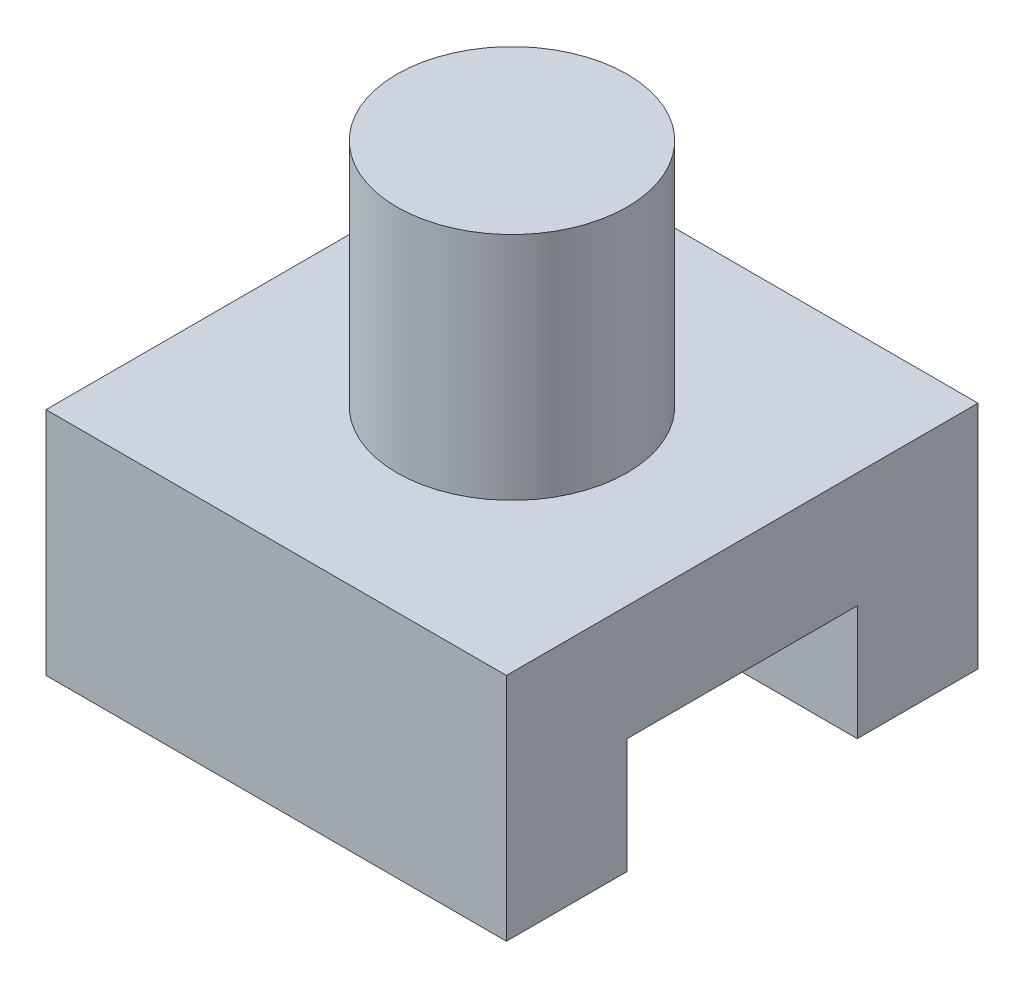
ISO-10303-21;
HEADER;
FILE_DESCRIPTION(('STEP AP214'),'2;1');
FILE_NAME('part.step','',(''),(''),'','','');
FILE_SCHEMA(('AUTOMOTIVE_DESIGN { 1 0 10303 214 1 1 1 1 }'));
ENDSEC;
DATA;
#1=APPLICATION_CONTEXT('core data for automotive mechanical design processes');
#2=APPLICATION_PROTOCOL_DEFINITION('international standard','automotive_design',2000,#1);
#3=PRODUCT_CONTEXT('',#1,'mechanical');
#4=PRODUCT('Part','Part','',(#3));
#5=PRODUCT_RELATED_PRODUCT_CATEGORY('part','',(#4));
#6=PRODUCT_DEFINITION_FORMATION('','',#4);
#7=PRODUCT_DEFINITION_CONTEXT('part definition',#1,'design');
#8=PRODUCT_DEFINITION('design','',#6,#7);
#9=PRODUCT_DEFINITION_SHAPE('','',#8);
#10=(LENGTH_UNIT() NAMED_UNIT(*) SI_UNIT(.MILLI.,.METRE.));
#11=(NAMED_UNIT(*) PLANE_ANGLE_UNIT() SI_UNIT($,.RADIAN.));
#12=(NAMED_UNIT(*) SI_UNIT($,.STERADIAN.) SOLID_ANGLE_UNIT());
#13=UNCERTAINTY_MEASURE_WITH_UNIT(LENGTH_MEASURE(1.E-05),#10,'distance_accuracy_value','');
#14=(GEOMETRIC_REPRESENTATION_CONTEXT(3) GLOBAL_UNCERTAINTY_ASSIGNED_CONTEXT((#13)) GLOBAL_UNIT_ASSIGNED_CONTEXT((#10,
#11,#12)) REPRESENTATION_CONTEXT('',''));
#15=CARTESIAN_POINT('',(0.,0.,0.));
#16=DIRECTION('',(0.,0.,1.));
#17=DIRECTION('',(1.,0.,0.));
#18=AXIS2_PLACEMENT_3D('',#15,#16,#17);
#19=CARTESIAN_POINT('',(101.6,-25.4,-52.0390243902439));
#20=DIRECTION('',(0.,0.,1.));
#21=DIRECTION('',(1.,0.,0.));
#22=AXIS2_PLACEMENT_3D('',#19,#20,#21);
#23=PLANE('',#22);
#24=DIRECTION('',(0.,1.,0.));
#25=VECTOR('',#24,1.);
#26=CARTESIAN_POINT('',(0.,-25.4,-52.0390243902439));
#27=LINE('',#26,#25);
#28=CARTESIAN_POINT('',(0.,-25.4,-52.0390243902439));
#29=VERTEX_POINT('',#28);
#30=CARTESIAN_POINT('',(0.,25.4,-52.0390243902439));
#31=VERTEX_POINT('',#30);
#32=EDGE_CURVE('E137',#29,#31,#27,.T.);
#33=ORIENTED_EDGE('',*,*,#32,.T.);
#34=DIRECTION('',(-1.,0.,0.));
#35=VECTOR('',#34,1.);
#36=CARTESIAN_POINT('',(101.6,25.4,-52.0390243902439));
#37=LINE('',#36,#35);
#38=CARTESIAN_POINT('',(101.6,25.4,-52.0390243902439));
#39=VERTEX_POINT('',#38);
#40=EDGE_CURVE('E42',#39,#31,#37,.T.);
#41=ORIENTED_EDGE('',*,*,#40,.F.);
#42=DIRECTION('',(0.,1.,0.));
#43=VECTOR('',#42,1.);
#44=CARTESIAN_POINT('',(101.6,-25.4,-52.0390243902439));
#45=LINE('',#44,#43);
#46=CARTESIAN_POINT('',(101.6,-25.4,-52.0390243902439));
#47=VERTEX_POINT('',#46);
#48=EDGE_CURVE('E152',#47,#39,#45,.T.);
#49=ORIENTED_EDGE('',*,*,#48,.F.);
#50=DIRECTION('',(-1.,0.,0.));
#51=VECTOR('',#50,1.);
#52=CARTESIAN_POINT('',(101.6,-25.4,-52.0390243902439));
#53=LINE('',#52,#51);
#54=EDGE_CURVE('E133',#47,#29,#53,.T.);
#55=ORIENTED_EDGE('',*,*,#54,.T.);
#56=EDGE_LOOP('',(#33,#41,#49,#55));
#57=FACE_BOUND('',#56,.T.);
#58=ADVANCED_FACE('F39',(#57),#23,.F.);
#59=CARTESIAN_POINT('',(101.6,25.4,52.0390243902439));
#60=DIRECTION('',(0.,-1.,0.));
#61=DIRECTION('',(0.,0.,-1.));
#62=AXIS2_PLACEMENT_3D('',#59,#60,#61);
#63=PLANE('',#62);
#64=CARTESIAN_POINT('',(50.8,25.4,0.));
#65=DIRECTION('',(0.,1.,0.));
#66=DIRECTION('',(0.,0.,1.));
#67=AXIS2_PLACEMENT_3D('',#64,#65,#66);
#68=CIRCLE('',#67,25.4);
#69=CARTESIAN_POINT('',(50.8,25.4,25.4));
#70=VERTEX_POINT('',#69);
#71=EDGE_CURVE('E11',#70,#70,#68,.T.);
#72=ORIENTED_EDGE('',*,*,#71,.F.);
#73=EDGE_LOOP('',(#72));
#74=FACE_BOUND('',#73,.T.);
#75=DIRECTION('',(0.,0.,1.));
#76=VECTOR('',#75,1.);
#77=CARTESIAN_POINT('',(0.,25.4,52.0390243902439));
#78=LINE('',#77,#76);
#79=CARTESIAN_POINT('',(0.,25.4,52.0390243902439));
#80=VERTEX_POINT('',#79);
#81=EDGE_CURVE('E140',#31,#80,#78,.T.);
#82=ORIENTED_EDGE('',*,*,#81,.T.);
#83=DIRECTION('',(-1.,0.,0.));
#84=VECTOR('',#83,1.);
#85=CARTESIAN_POINT('',(101.6,25.4,52.0390243902439));
#86=LINE('',#85,#84);
#87=CARTESIAN_POINT('',(101.6,25.4,52.0390243902439));
#88=VERTEX_POINT('',#87);
#89=EDGE_CURVE('E161',#88,#80,#86,.T.);
#90=ORIENTED_EDGE('',*,*,#89,.F.);
#91=DIRECTION('',(0.,0.,1.));
#92=VECTOR('',#91,1.);
#93=CARTESIAN_POINT('',(101.6,25.4,52.0390243902439));
#94=LINE('',#93,#92);
#95=EDGE_CURVE('E100',#39,#88,#94,.T.);
#96=ORIENTED_EDGE('',*,*,#95,.F.);
#97=ORIENTED_EDGE('',*,*,#40,.T.);
#98=EDGE_LOOP('',(#82,#90,#96,#97));
#99=FACE_BOUND('',#98,.T.);
#100=ADVANCED_FACE('F167',(#74,#99),#63,.F.);
#101=CARTESIAN_POINT('',(101.6,-25.4,52.0390243902439));
#102=DIRECTION('',(0.,0.,-1.));
#103=DIRECTION('',(-1.,0.,0.));
#104=AXIS2_PLACEMENT_3D('',#101,#102,#103);
#105=PLANE('',#104);
#106=DIRECTION('',(0.,-1.,0.));
#107=VECTOR('',#106,1.);
#108=CARTESIAN_POINT('',(0.,-25.4,52.0390243902439));
#109=LINE('',#108,#107);
#110=CARTESIAN_POINT('',(0.,-25.4,52.0390243902439));
#111=VERTEX_POINT('',#110);
#112=EDGE_CURVE('E143',#80,#111,#109,.T.);
#113=ORIENTED_EDGE('',*,*,#112,.T.);
#114=DIRECTION('',(-1.,0.,0.));
#115=VECTOR('',#114,1.);
#116=CARTESIAN_POINT('',(101.6,-25.4,52.0390243902439));
#117=LINE('',#116,#115);
#118=CARTESIAN_POINT('',(101.6,-25.4,52.0390243902439));
#119=VERTEX_POINT('',#118);
#120=EDGE_CURVE('E159',#119,#111,#117,.T.);
#121=ORIENTED_EDGE('',*,*,#120,.F.);
#122=DIRECTION('',(0.,-1.,0.));
#123=VECTOR('',#122,1.);
#124=CARTESIAN_POINT('',(101.6,-25.4,52.0390243902439));
#125=LINE('',#124,#123);
#126=EDGE_CURVE('E182',#88,#119,#125,.T.);
#127=ORIENTED_EDGE('',*,*,#126,.F.);
#128=ORIENTED_EDGE('',*,*,#89,.T.);
#129=EDGE_LOOP('',(#113,#121,#127,#128));
#130=FACE_BOUND('',#129,.T.);
#131=ADVANCED_FACE('F176',(#130),#105,.F.);
#132=CARTESIAN_POINT('',(101.6,-25.4,52.0390243902439));
#133=DIRECTION('',(0.,1.,0.));
#134=DIRECTION('',(0.,0.,1.));
#135=AXIS2_PLACEMENT_3D('',#132,#133,#134);
#136=PLANE('',#135);
#137=DIRECTION('',(0.,0.,-1.));
#138=VECTOR('',#137,1.);
#139=CARTESIAN_POINT('',(0.,-25.4,52.0390243902439));
#140=LINE('',#139,#138);
#141=CARTESIAN_POINT('',(0.,-25.4,25.4));
#142=VERTEX_POINT('',#141);
#143=EDGE_CURVE('E145',#111,#142,#140,.T.);
#144=ORIENTED_EDGE('',*,*,#143,.T.);
#145=DIRECTION('',(-1.,0.,0.));
#146=VECTOR('',#145,1.);
#147=CARTESIAN_POINT('',(101.6,-25.4,25.4));
#148=LINE('',#147,#146);
#149=CARTESIAN_POINT('',(101.6,-25.4,25.4));
#150=VERTEX_POINT('',#149);
#151=EDGE_CURVE('E156',#150,#142,#148,.T.);
#152=ORIENTED_EDGE('',*,*,#151,.F.);
#153=DIRECTION('',(0.,0.,-1.));
#154=VECTOR('',#153,1.);
#155=CARTESIAN_POINT('',(101.6,-25.4,52.0390243902439));
#156=LINE('',#155,#154);
#157=EDGE_CURVE('E181',#119,#150,#156,.T.);
#158=ORIENTED_EDGE('',*,*,#157,.F.);
#159=ORIENTED_EDGE('',*,*,#120,.T.);
#160=EDGE_LOOP('',(#144,#152,#158,#159));
#161=FACE_BOUND('',#160,.T.);
#162=ADVANCED_FACE('F179',(#161),#136,.F.);
#163=CARTESIAN_POINT('',(101.6,0.,25.4));
#164=DIRECTION('',(0.,0.,1.));
#165=DIRECTION('',(0.,-1.,0.));
#166=AXIS2_PLACEMENT_3D('',#163,#164,#165);
#167=PLANE('',#166);
#168=DIRECTION('',(0.,1.,0.));
#169=VECTOR('',#168,1.);
#170=CARTESIAN_POINT('',(0.,0.,25.4));
#171=LINE('',#170,#169);
#172=CARTESIAN_POINT('',(0.,0.,25.4));
#173=VERTEX_POINT('',#172);
#174=EDGE_CURVE('E147',#142,#173,#171,.T.);
#175=ORIENTED_EDGE('',*,*,#174,.T.);
#176=DIRECTION('',(-1.,0.,0.));
#177=VECTOR('',#176,1.);
#178=CARTESIAN_POINT('',(101.6,0.,25.4));
#179=LINE('',#178,#177);
#180=CARTESIAN_POINT('',(101.6,0.,25.4));
#181=VERTEX_POINT('',#180);
#182=EDGE_CURVE('E128',#181,#173,#179,.T.);
#183=ORIENTED_EDGE('',*,*,#182,.F.);
#184=DIRECTION('',(0.,1.,0.));
#185=VECTOR('',#184,1.);
#186=CARTESIAN_POINT('',(101.6,0.,25.4));
#187=LINE('',#186,#185);
#188=EDGE_CURVE('E119',#150,#181,#187,.T.);
#189=ORIENTED_EDGE('',*,*,#188,.F.);
#190=ORIENTED_EDGE('',*,*,#151,.T.);
#191=EDGE_LOOP('',(#175,#183,#189,#190));
#192=FACE_BOUND('',#191,.T.);
#193=ADVANCED_FACE('F209',(#192),#167,.F.);
#194=CARTESIAN_POINT('',(101.6,0.,25.4));
#195=DIRECTION('',(0.,1.,0.));
#196=DIRECTION('',(0.,0.,1.));
#197=AXIS2_PLACEMENT_3D('',#194,#195,#196);
#198=PLANE('',#197);
#199=DIRECTION('',(0.,0.,-1.));
#200=VECTOR('',#199,1.);
#201=CARTESIAN_POINT('',(0.,0.,25.4));
#202=LINE('',#201,#200);
#203=CARTESIAN_POINT('',(0.,0.,-25.4));
#204=VERTEX_POINT('',#203);
#205=EDGE_CURVE('E127',#173,#204,#202,.T.);
#206=ORIENTED_EDGE('',*,*,#205,.T.);
#207=DIRECTION('',(-1.,0.,0.));
#208=VECTOR('',#207,1.);
#209=CARTESIAN_POINT('',(101.6,0.,-25.4));
#210=LINE('',#209,#208);
#211=CARTESIAN_POINT('',(101.6,0.,-25.4));
#212=VERTEX_POINT('',#211);
#213=EDGE_CURVE('E124',#212,#204,#210,.T.);
#214=ORIENTED_EDGE('',*,*,#213,.F.);
#215=DIRECTION('',(0.,0.,-1.));
#216=VECTOR('',#215,1.);
#217=CARTESIAN_POINT('',(101.6,0.,25.4));
#218=LINE('',#217,#216);
#219=EDGE_CURVE('E113',#181,#212,#218,.T.);
#220=ORIENTED_EDGE('',*,*,#219,.F.);
#221=ORIENTED_EDGE('',*,*,#182,.T.);
#222=EDGE_LOOP('',(#206,#214,#220,#221));
#223=FACE_BOUND('',#222,.T.);
#224=ADVANCED_FACE('F125',(#223),#198,.F.);
#225=CARTESIAN_POINT('',(101.6,0.,-25.4));
#226=DIRECTION('',(0.,0.,-1.));
#227=DIRECTION('',(0.,1.,0.));
#228=AXIS2_PLACEMENT_3D('',#225,#226,#227);
#229=PLANE('',#228);
#230=DIRECTION('',(0.,-1.,0.));
#231=VECTOR('',#230,1.);
#232=CARTESIAN_POINT('',(0.,0.,-25.4));
#233=LINE('',#232,#231);
#234=CARTESIAN_POINT('',(0.,-25.4,-25.4));
#235=VERTEX_POINT('',#234);
#236=EDGE_CURVE('E85',#204,#235,#233,.T.);
#237=ORIENTED_EDGE('',*,*,#236,.T.);
#238=DIRECTION('',(-1.,0.,0.));
#239=VECTOR('',#238,1.);
#240=CARTESIAN_POINT('',(101.6,-25.4,-25.4));
#241=LINE('',#240,#239);
#242=CARTESIAN_POINT('',(101.6,-25.4,-25.4));
#243=VERTEX_POINT('',#242);
#244=EDGE_CURVE('E129',#243,#235,#241,.T.);
#245=ORIENTED_EDGE('',*,*,#244,.F.);
#246=DIRECTION('',(0.,-1.,0.));
#247=VECTOR('',#246,1.);
#248=CARTESIAN_POINT('',(101.6,0.,-25.4));
#249=LINE('',#248,#247);
#250=EDGE_CURVE('E117',#212,#243,#249,.T.);
#251=ORIENTED_EDGE('',*,*,#250,.F.);
#252=ORIENTED_EDGE('',*,*,#213,.T.);
#253=EDGE_LOOP('',(#237,#245,#251,#252));
#254=FACE_BOUND('',#253,.T.);
#255=ADVANCED_FACE('F131',(#254),#229,.F.);
#256=CARTESIAN_POINT('',(101.6,-25.4,-25.4));
#257=DIRECTION('',(0.,1.,0.));
#258=DIRECTION('',(0.,0.,1.));
#259=AXIS2_PLACEMENT_3D('',#256,#257,#258);
#260=PLANE('',#259);
#261=DIRECTION('',(0.,0.,-1.));
#262=VECTOR('',#261,1.);
#263=CARTESIAN_POINT('',(0.,-25.4,-25.4));
#264=LINE('',#263,#262);
#265=EDGE_CURVE('E91',#235,#29,#264,.T.);
#266=ORIENTED_EDGE('',*,*,#265,.T.);
#267=ORIENTED_EDGE('',*,*,#54,.F.);
#268=DIRECTION('',(0.,0.,-1.));
#269=VECTOR('',#268,1.);
#270=CARTESIAN_POINT('',(101.6,-25.4,-25.4));
#271=LINE('',#270,#269);
#272=EDGE_CURVE('E56',#243,#47,#271,.T.);
#273=ORIENTED_EDGE('',*,*,#272,.F.);
#274=ORIENTED_EDGE('',*,*,#244,.T.);
#275=EDGE_LOOP('',(#266,#267,#273,#274));
#276=FACE_BOUND('',#275,.T.);
#277=ADVANCED_FACE('F217',(#276),#260,.F.);
#278=CARTESIAN_POINT('',(101.6,0.,0.));
#279=DIRECTION('',(-1.,0.,0.));
#280=DIRECTION('',(0.,0.,1.));
#281=AXIS2_PLACEMENT_3D('',#278,#279,#280);
#282=PLANE('',#281);
#283=ORIENTED_EDGE('',*,*,#48,.T.);
#284=ORIENTED_EDGE('',*,*,#95,.T.);
#285=ORIENTED_EDGE('',*,*,#126,.T.);
#286=ORIENTED_EDGE('',*,*,#157,.T.);
#287=ORIENTED_EDGE('',*,*,#188,.T.);
#288=ORIENTED_EDGE('',*,*,#219,.T.);
#289=ORIENTED_EDGE('',*,*,#250,.T.);
#290=ORIENTED_EDGE('',*,*,#272,.T.);
#291=EDGE_LOOP('',(#283,#284,#285,#286,#287,#288,#289,#290));
#292=FACE_BOUND('',#291,.T.);
#293=ADVANCED_FACE('F115',(#292),#282,.F.);
#294=CARTESIAN_POINT('',(0.,0.,0.));
#295=DIRECTION('',(-1.,0.,0.));
#296=DIRECTION('',(0.,0.,1.));
#297=AXIS2_PLACEMENT_3D('',#294,#295,#296);
#298=PLANE('',#297);
#299=ORIENTED_EDGE('',*,*,#32,.F.);
#300=ORIENTED_EDGE('',*,*,#265,.F.);
#301=ORIENTED_EDGE('',*,*,#236,.F.);
#302=ORIENTED_EDGE('',*,*,#205,.F.);
#303=ORIENTED_EDGE('',*,*,#174,.F.);
#304=ORIENTED_EDGE('',*,*,#143,.F.);
#305=ORIENTED_EDGE('',*,*,#112,.F.);
#306=ORIENTED_EDGE('',*,*,#81,.F.);
#307=EDGE_LOOP('',(#299,#300,#301,#302,#303,#304,#305,#306));
#308=FACE_BOUND('',#307,.T.);
#309=ADVANCED_FACE('F172',(#308),#298,.T.);
#310=CARTESIAN_POINT('',(50.8,76.2,0.));
#311=DIRECTION('',(0.,-1.,0.));
#312=DIRECTION('',(0.,0.,-1.));
#313=AXIS2_PLACEMENT_3D('',#310,#311,#312);
#314=CYLINDRICAL_SURFACE('',#313,25.4);
#315=CARTESIAN_POINT('',(50.8,76.2,0.));
#316=DIRECTION('',(0.,1.,0.));
#317=DIRECTION('',(0.,0.,1.));
#318=AXIS2_PLACEMENT_3D('',#315,#316,#317);
#319=CIRCLE('',#318,25.4);
#320=CARTESIAN_POINT('',(50.8,76.2,25.4));
#321=VERTEX_POINT('',#320);
#322=EDGE_CURVE('E141',#321,#321,#319,.T.);
#323=ORIENTED_EDGE('',*,*,#322,.F.);
#324=EDGE_LOOP('',(#323));
#325=FACE_BOUND('',#324,.T.);
#326=ORIENTED_EDGE('',*,*,#71,.T.);
#327=EDGE_LOOP('',(#326));
#328=FACE_BOUND('',#327,.T.);
#329=ADVANCED_FACE('F193',(#325,#328),#314,.T.);
#330=CARTESIAN_POINT('',(50.8,76.2,0.));
#331=DIRECTION('',(0.,1.,0.));
#332=DIRECTION('',(0.,0.,1.));
#333=AXIS2_PLACEMENT_3D('',#330,#331,#332);
#334=PLANE('',#333);
#335=ORIENTED_EDGE('',*,*,#322,.T.);
#336=EDGE_LOOP('',(#335));
#337=FACE_BOUND('',#336,.T.);
#338=ADVANCED_FACE('F191',(#337),#334,.T.);
#339=CLOSED_SHELL('',(#58,#100,#131,#162,#193,#224,#255,#277,#293,#309,#329,#338));
#340=MANIFOLD_SOLID_BREP('B2',#339);
#341=ADVANCED_BREP_SHAPE_REPRESENTATION('',(#18,#340),#14);
#342=SHAPE_DEFINITION_REPRESENTATION(#9,#341);
ENDSEC;
END-ISO-10303-21;
